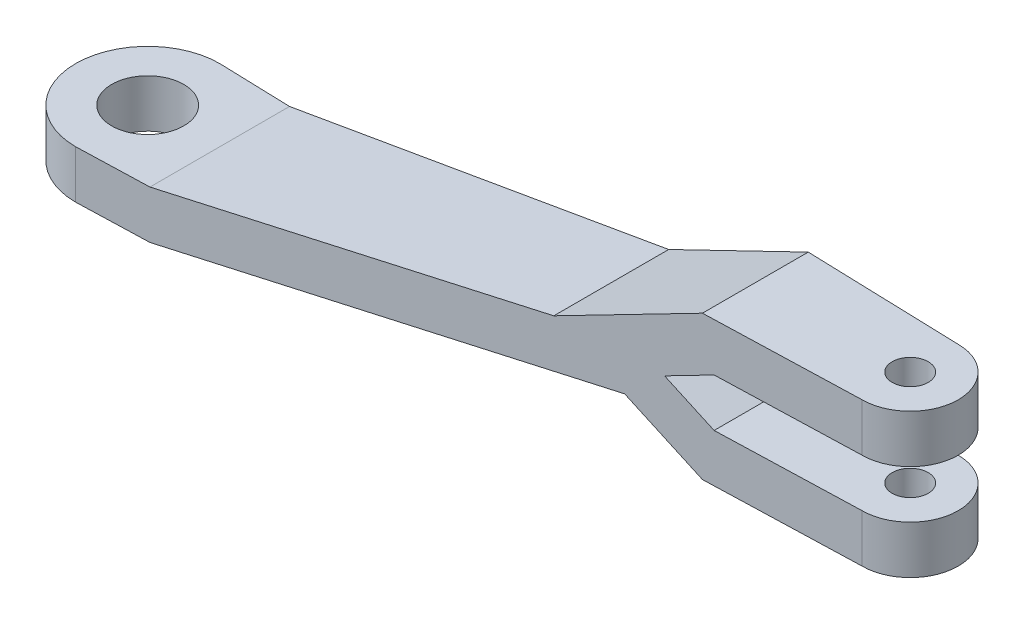
ISO-10303-21;
HEADER;
FILE_DESCRIPTION(('STEP AP214'),'2;1');
FILE_NAME('part.step','',(''),(''),'','','');
FILE_SCHEMA(('AUTOMOTIVE_DESIGN { 1 0 10303 214 1 1 1 1 }'));
ENDSEC;
DATA;
#1=APPLICATION_CONTEXT('core data for automotive mechanical design processes');
#2=APPLICATION_PROTOCOL_DEFINITION('international standard','automotive_design',2000,#1);
#3=PRODUCT_CONTEXT('',#1,'mechanical');
#4=PRODUCT('Part','Part','',(#3));
#5=PRODUCT_RELATED_PRODUCT_CATEGORY('part','',(#4));
#6=PRODUCT_DEFINITION_FORMATION('','',#4);
#7=PRODUCT_DEFINITION_CONTEXT('part definition',#1,'design');
#8=PRODUCT_DEFINITION('design','',#6,#7);
#9=PRODUCT_DEFINITION_SHAPE('','',#8);
#10=(LENGTH_UNIT() NAMED_UNIT(*) SI_UNIT(.MILLI.,.METRE.));
#11=(NAMED_UNIT(*) PLANE_ANGLE_UNIT() SI_UNIT($,.RADIAN.));
#12=(NAMED_UNIT(*) SI_UNIT($,.STERADIAN.) SOLID_ANGLE_UNIT());
#13=UNCERTAINTY_MEASURE_WITH_UNIT(LENGTH_MEASURE(1.E-05),#10,'distance_accuracy_value','');
#14=(GEOMETRIC_REPRESENTATION_CONTEXT(3) GLOBAL_UNCERTAINTY_ASSIGNED_CONTEXT((#13)) GLOBAL_UNIT_ASSIGNED_CONTEXT((#10,
#11,#12)) REPRESENTATION_CONTEXT('',''));
#15=CARTESIAN_POINT('',(0.,0.,0.));
#16=DIRECTION('',(0.,0.,1.));
#17=DIRECTION('',(1.,0.,0.));
#18=AXIS2_PLACEMENT_3D('',#15,#16,#17);
#19=CARTESIAN_POINT('',(-31.75,-6.,0.));
#20=DIRECTION('',(0.,1.,0.));
#21=DIRECTION('',(0.,0.,1.));
#22=AXIS2_PLACEMENT_3D('',#19,#20,#21);
#23=CYLINDRICAL_SURFACE('',#22,3.);
#24=CARTESIAN_POINT('',(-31.75,-0.249999999906133,0.));
#25=DIRECTION('',(0.,-1.,0.));
#26=DIRECTION('',(0.,0.,-1.));
#27=AXIS2_PLACEMENT_3D('',#24,#25,#26);
#28=CIRCLE('',#27,3.);
#29=CARTESIAN_POINT('',(-31.75,-0.249999999906133,-3.));
#30=VERTEX_POINT('',#29);
#31=CARTESIAN_POINT('',(-31.75,-0.249999999906133,3.00000000000001));
#32=VERTEX_POINT('',#31);
#33=EDGE_CURVE('E242',#30,#32,#28,.F.);
#34=ORIENTED_EDGE('',*,*,#33,.F.);
#35=DIRECTION('',(0.,1.,0.));
#36=VECTOR('',#35,1.);
#37=CARTESIAN_POINT('',(-31.75,-6.,-3.));
#38=LINE('',#37,#36);
#39=CARTESIAN_POINT('',(-31.75,-2.24999999967123,-3.));
#40=VERTEX_POINT('',#39);
#41=EDGE_CURVE('E161',#40,#30,#38,.T.);
#42=ORIENTED_EDGE('',*,*,#41,.F.);
#43=CARTESIAN_POINT('',(-31.75,-2.24999999967123,0.));
#44=DIRECTION('',(0.,-1.,0.));
#45=DIRECTION('',(0.,0.,-1.));
#46=AXIS2_PLACEMENT_3D('',#43,#44,#45);
#47=CIRCLE('',#46,3.);
#48=CARTESIAN_POINT('',(-31.75,-2.24999999967123,3.00000000000001));
#49=VERTEX_POINT('',#48);
#50=EDGE_CURVE('E147',#40,#49,#47,.F.);
#51=ORIENTED_EDGE('',*,*,#50,.T.);
#52=DIRECTION('',(0.,1.,0.));
#53=VECTOR('',#52,1.);
#54=CARTESIAN_POINT('',(-31.75,-6.,3.00000000000001));
#55=LINE('',#54,#53);
#56=EDGE_CURVE('E159',#49,#32,#55,.T.);
#57=ORIENTED_EDGE('',*,*,#56,.T.);
#58=EDGE_LOOP('',(#34,#42,#51,#57));
#59=FACE_BOUND('',#58,.T.);
#60=ADVANCED_FACE('F36',(#59),#23,.T.);
#61=CARTESIAN_POINT('',(0.,-6.,0.));
#62=DIRECTION('',(0.,1.,0.));
#63=DIRECTION('',(0.,0.,1.));
#64=AXIS2_PLACEMENT_3D('',#61,#62,#63);
#65=CYLINDRICAL_SURFACE('',#64,2.);
#66=DIRECTION('',(0.,1.,0.));
#67=VECTOR('',#66,1.);
#68=CARTESIAN_POINT('',(0.,-6.,2.));
#69=LINE('',#68,#67);
#70=CARTESIAN_POINT('',(0.,0.,2.));
#71=VERTEX_POINT('',#70);
#72=CARTESIAN_POINT('',(0.,2.,2.));
#73=VERTEX_POINT('',#72);
#74=EDGE_CURVE('E180',#71,#73,#69,.T.);
#75=ORIENTED_EDGE('',*,*,#74,.F.);
#76=CARTESIAN_POINT('',(0.,0.,0.));
#77=DIRECTION('',(0.,-1.,0.));
#78=DIRECTION('',(1.,0.,0.));
#79=AXIS2_PLACEMENT_3D('',#76,#77,#78);
#80=CIRCLE('',#79,2.);
#81=CARTESIAN_POINT('',(0.,0.,-2.));
#82=VERTEX_POINT('',#81);
#83=EDGE_CURVE('E194',#71,#82,#80,.F.);
#84=ORIENTED_EDGE('',*,*,#83,.T.);
#85=DIRECTION('',(0.,1.,0.));
#86=VECTOR('',#85,1.);
#87=CARTESIAN_POINT('',(0.,-6.,-2.));
#88=LINE('',#87,#86);
#89=CARTESIAN_POINT('',(0.,2.,-2.));
#90=VERTEX_POINT('',#89);
#91=EDGE_CURVE('E172',#82,#90,#88,.T.);
#92=ORIENTED_EDGE('',*,*,#91,.T.);
#93=CARTESIAN_POINT('',(0.,2.,0.));
#94=DIRECTION('',(0.,1.,0.));
#95=DIRECTION('',(0.,0.,1.));
#96=AXIS2_PLACEMENT_3D('',#93,#94,#95);
#97=CIRCLE('',#96,2.);
#98=EDGE_CURVE('E189',#90,#73,#97,.F.);
#99=ORIENTED_EDGE('',*,*,#98,.T.);
#100=EDGE_LOOP('',(#75,#84,#92,#99));
#101=FACE_BOUND('',#100,.T.);
#102=ADVANCED_FACE('F271',(#101),#65,.T.);
#103=CARTESIAN_POINT('',(0.,6.,0.));
#104=DIRECTION('',(0.,1.,0.));
#105=DIRECTION('',(0.,0.,1.));
#106=AXIS2_PLACEMENT_3D('',#103,#104,#105);
#107=PLANE('',#106);
#108=CARTESIAN_POINT('',(0.,6.,0.));
#109=DIRECTION('',(0.,1.,0.));
#110=DIRECTION('',(0.,0.,1.));
#111=AXIS2_PLACEMENT_3D('',#108,#109,#110);
#112=CIRCLE('',#111,0.75);
#113=CARTESIAN_POINT('',(0.,6.,0.75));
#114=VERTEX_POINT('',#113);
#115=EDGE_CURVE('E175',#114,#114,#112,.T.);
#116=ORIENTED_EDGE('',*,*,#115,.F.);
#117=EDGE_LOOP('',(#116));
#118=FACE_BOUND('',#117,.T.);
#119=DIRECTION('',(0.999504367728677,0.,0.0314804525268874));
#120=VECTOR('',#119,1.);
#121=CARTESIAN_POINT('',(0.0629296995973984,6.,-1.9980179622174));
#122=LINE('',#121,#120);
#123=CARTESIAN_POINT('',(-6.4481335756774,6.,-2.20309082128118));
#124=VERTEX_POINT('',#123);
#125=CARTESIAN_POINT('',(0.,6.,-2.));
#126=VERTEX_POINT('',#125);
#127=EDGE_CURVE('E259',#124,#126,#122,.T.);
#128=ORIENTED_EDGE('',*,*,#127,.F.);
#129=DIRECTION('',(0.,0.,1.));
#130=VECTOR('',#129,1.);
#131=CARTESIAN_POINT('',(-6.4481335756774,6.,0.));
#132=LINE('',#131,#130);
#133=CARTESIAN_POINT('',(-6.4481335756774,6.,2.20309082128118));
#134=VERTEX_POINT('',#133);
#135=EDGE_CURVE('E168',#124,#134,#132,.T.);
#136=ORIENTED_EDGE('',*,*,#135,.T.);
#137=DIRECTION('',(0.999504367728677,0.,-0.0314804525268876));
#138=VECTOR('',#137,1.);
#139=CARTESIAN_POINT('',(0.0629296995973989,6.,1.99801796221741));
#140=LINE('',#139,#138);
#141=CARTESIAN_POINT('',(0.,6.,2.));
#142=VERTEX_POINT('',#141);
#143=EDGE_CURVE('E255',#134,#142,#140,.T.);
#144=ORIENTED_EDGE('',*,*,#143,.T.);
#145=CARTESIAN_POINT('',(0.,6.,0.));
#146=DIRECTION('',(0.,1.,0.));
#147=DIRECTION('',(0.,0.,1.));
#148=AXIS2_PLACEMENT_3D('',#145,#146,#147);
#149=CIRCLE('',#148,2.);
#150=EDGE_CURVE('E258',#142,#126,#149,.T.);
#151=ORIENTED_EDGE('',*,*,#150,.T.);
#152=EDGE_LOOP('',(#128,#136,#144,#151));
#153=FACE_BOUND('',#152,.T.);
#154=ADVANCED_FACE('F268',(#118,#153),#107,.T.);
#155=CARTESIAN_POINT('',(0.,-6.,0.));
#156=DIRECTION('',(0.,1.,0.));
#157=DIRECTION('',(0.,0.,1.));
#158=AXIS2_PLACEMENT_3D('',#155,#156,#157);
#159=CYLINDRICAL_SURFACE('',#158,0.75);
#160=CARTESIAN_POINT('',(0.,4.,0.));
#161=DIRECTION('',(0.,1.,0.));
#162=DIRECTION('',(-1.,0.,0.));
#163=AXIS2_PLACEMENT_3D('',#160,#161,#162);
#164=CIRCLE('',#163,0.75);
#165=CARTESIAN_POINT('',(-0.75,4.,0.));
#166=VERTEX_POINT('',#165);
#167=EDGE_CURVE('E183',#166,#166,#164,.F.);
#168=ORIENTED_EDGE('',*,*,#167,.T.);
#169=EDGE_LOOP('',(#168));
#170=FACE_BOUND('',#169,.T.);
#171=ORIENTED_EDGE('',*,*,#115,.T.);
#172=EDGE_LOOP('',(#171));
#173=FACE_BOUND('',#172,.T.);
#174=ADVANCED_FACE('F266',(#170,#173),#159,.F.);
#175=CARTESIAN_POINT('',(0.,4.,0.));
#176=DIRECTION('',(0.,1.,0.));
#177=DIRECTION('',(-1.,0.,0.));
#178=AXIS2_PLACEMENT_3D('',#175,#176,#177);
#179=CIRCLE('',#178,2.);
#180=CARTESIAN_POINT('',(0.,4.,-2.));
#181=VERTEX_POINT('',#180);
#182=CARTESIAN_POINT('',(0.,4.,2.));
#183=VERTEX_POINT('',#182);
#184=EDGE_CURVE('E51',#181,#183,#179,.F.);
#185=ORIENTED_EDGE('',*,*,#184,.F.);
#186=EDGE_CURVE('E178',#181,#126,#88,.T.);
#187=ORIENTED_EDGE('',*,*,#186,.T.);
#188=ORIENTED_EDGE('',*,*,#150,.F.);
#189=EDGE_CURVE('E181',#183,#142,#69,.T.);
#190=ORIENTED_EDGE('',*,*,#189,.F.);
#191=EDGE_LOOP('',(#185,#187,#188,#190));
#192=FACE_BOUND('',#191,.T.);
#193=ADVANCED_FACE('F274',(#192),#65,.T.);
#194=CARTESIAN_POINT('',(0.0629296995973984,-6.,-1.9980179622174));
#195=DIRECTION('',(-0.0314804525268874,0.,0.999504367728677));
#196=DIRECTION('',(0.999504367728677,0.,0.0314804525268874));
#197=AXIS2_PLACEMENT_3D('',#194,#195,#196);
#198=PLANE('',#197);
#199=DIRECTION('',(-0.894072492677012,-0.447036246355019,-0.0281597635488822));
#200=VECTOR('',#199,1.);
#201=CARTESIAN_POINT('',(-6.03444407013955,6.20684475277657,-2.19006123055558));
#202=LINE('',#201,#200);
#203=CARTESIAN_POINT('',(-12.4481335754558,2.99999999999999,-2.39206719922695));
#204=VERTEX_POINT('',#203);
#205=EDGE_CURVE('E309',#124,#204,#202,.T.);
#206=ORIENTED_EDGE('',*,*,#205,.F.);
#207=ORIENTED_EDGE('',*,*,#127,.T.);
#208=ORIENTED_EDGE('',*,*,#186,.F.);
#209=DIRECTION('',(-0.999504367728677,0.,-0.0314804525268874));
#210=VECTOR('',#209,1.);
#211=CARTESIAN_POINT('',(0.0629296995973973,4.,-1.9980179622174));
#212=LINE('',#211,#210);
#213=CARTESIAN_POINT('',(-5.97599762072085,4.,-2.18822039750302));
#214=VERTEX_POINT('',#213);
#215=EDGE_CURVE('E276',#181,#214,#212,.T.);
#216=ORIENTED_EDGE('',*,*,#215,.T.);
#217=DIRECTION('',(-0.894072492677012,-0.447036246355019,-0.0281597635488822));
#218=VECTOR('',#217,1.);
#219=CARTESIAN_POINT('',(-5.14072613509668,4.41763574282751,-2.16191263417627));
#220=LINE('',#219,#218);
#221=CARTESIAN_POINT('',(-7.97599762072697,2.99999999996,-2.25121252348746));
#222=VERTEX_POINT('',#221);
#223=EDGE_CURVE('E170',#214,#222,#220,.T.);
#224=ORIENTED_EDGE('',*,*,#223,.T.);
#225=DIRECTION('',(-0.894072492691305,0.447036246326404,-0.0281597635493324));
#226=VECTOR('',#225,1.);
#227=CARTESIAN_POINT('',(2.05356446462519,-2.01478104250015,-1.93532080426377));
#228=LINE('',#227,#226);
#229=CARTESIAN_POINT('',(-5.97599762072084,2.,-2.18822039750302));
#230=VERTEX_POINT('',#229);
#231=EDGE_CURVE('E205',#230,#222,#228,.T.);
#232=ORIENTED_EDGE('',*,*,#231,.F.);
#233=DIRECTION('',(-0.999504367728677,0.,-0.0314804525268874));
#234=VECTOR('',#233,1.);
#235=CARTESIAN_POINT('',(0.0629296995973984,2.,-1.9980179622174));
#236=LINE('',#235,#234);
#237=EDGE_CURVE('E287',#90,#230,#236,.T.);
#238=ORIENTED_EDGE('',*,*,#237,.F.);
#239=ORIENTED_EDGE('',*,*,#91,.F.);
#240=DIRECTION('',(0.999504367728677,0.,0.0314804525268874));
#241=VECTOR('',#240,1.);
#242=CARTESIAN_POINT('',(0.0629296995973978,0.,-1.9980179622174));
#243=LINE('',#242,#241);
#244=CARTESIAN_POINT('',(-6.4481335756774,0.,-2.20309082128118));
#245=VERTEX_POINT('',#244);
#246=EDGE_CURVE('E229',#245,#82,#243,.T.);
#247=ORIENTED_EDGE('',*,*,#246,.F.);
#248=DIRECTION('',(-0.894072492691305,0.447036246326405,-0.0281597635493324));
#249=VECTOR('',#248,1.);
#250=CARTESIAN_POINT('',(1.15984652963279,-3.80399005249131,-1.96346940064149));
#251=LINE('',#250,#249);
#252=CARTESIAN_POINT('',(-9.58839111091583,1.57012876755161,-2.30199657042254));
#253=VERTEX_POINT('',#252);
#254=EDGE_CURVE('E207',#245,#253,#251,.T.);
#255=ORIENTED_EDGE('',*,*,#254,.T.);
#256=DIRECTION('',(0.980233001153636,0.195422853475057,0.0308734803512955));
#257=VECTOR('',#256,1.);
#258=CARTESIAN_POINT('',(-1.75578846478246,3.13166521596971,-2.05530042408764));
#259=LINE('',#258,#257);
#260=CARTESIAN_POINT('',(-28.7500000000529,-2.24999999967123,-2.90551181102529));
#261=VERTEX_POINT('',#260);
#262=EDGE_CURVE('E44',#261,#253,#259,.T.);
#263=ORIENTED_EDGE('',*,*,#262,.F.);
#264=DIRECTION('',(0.999504367728677,0.,0.0314804525268874));
#265=VECTOR('',#264,1.);
#266=CARTESIAN_POINT('',(0.0629296995973984,-2.24999999967123,-1.9980179622174));
#267=LINE('',#266,#265);
#268=EDGE_CURVE('E162',#40,#261,#267,.T.);
#269=ORIENTED_EDGE('',*,*,#268,.F.);
#270=ORIENTED_EDGE('',*,*,#41,.T.);
#271=DIRECTION('',(0.999504367728677,0.,0.0314804525268874));
#272=VECTOR('',#271,1.);
#273=CARTESIAN_POINT('',(0.0629296995973984,-0.249999999906133,-1.9980179622174));
#274=LINE('',#273,#272);
#275=CARTESIAN_POINT('',(-28.7500000000187,-0.249999999906133,-2.90551181102421));
#276=VERTEX_POINT('',#275);
#277=EDGE_CURVE('E202',#30,#276,#274,.T.);
#278=ORIENTED_EDGE('',*,*,#277,.T.);
#279=DIRECTION('',(-0.980233001153636,-0.195422853475056,-0.0308734803512955));
#280=VECTOR('',#279,1.);
#281=CARTESIAN_POINT('',(-2.13890832504786,5.05528503241653,-2.06736719134009));
#282=LINE('',#281,#280);
#283=EDGE_CURVE('E11',#204,#276,#282,.T.);
#284=ORIENTED_EDGE('',*,*,#283,.F.);
#285=EDGE_LOOP('',(#206,#207,#208,#216,#224,#232,#238,#239,#247,#255,#263,#269,#270,#278,#284));
#286=FACE_BOUND('',#285,.T.);
#287=ADVANCED_FACE('F226',(#286),#198,.F.);
#288=CARTESIAN_POINT('',(0.0629296995973989,-6.,1.99801796221741));
#289=DIRECTION('',(0.0314804525268876,0.,0.999504367728677));
#290=DIRECTION('',(0.999504367728677,0.,-0.0314804525268876));
#291=AXIS2_PLACEMENT_3D('',#288,#289,#290);
#292=PLANE('',#291);
#293=ORIENTED_EDGE('',*,*,#143,.F.);
#294=DIRECTION('',(-0.894072492677012,-0.447036246355019,0.0281597635488824));
#295=VECTOR('',#294,1.);
#296=CARTESIAN_POINT('',(-6.03444407013954,6.20684475277657,2.19006123055558));
#297=LINE('',#296,#295);
#298=CARTESIAN_POINT('',(-12.4481335754558,2.99999999999999,2.39206719922696));
#299=VERTEX_POINT('',#298);
#300=EDGE_CURVE('E59',#134,#299,#297,.T.);
#301=ORIENTED_EDGE('',*,*,#300,.T.);
#302=DIRECTION('',(-0.980233001153636,-0.195422853475056,0.0308734803512958));
#303=VECTOR('',#302,1.);
#304=CARTESIAN_POINT('',(-2.13890832504786,5.05528503241653,2.06736719134009));
#305=LINE('',#304,#303);
#306=CARTESIAN_POINT('',(-28.7500000000187,-0.249999999906133,2.90551181102422));
#307=VERTEX_POINT('',#306);
#308=EDGE_CURVE('E253',#299,#307,#305,.T.);
#309=ORIENTED_EDGE('',*,*,#308,.T.);
#310=DIRECTION('',(0.999504367728677,0.,-0.0314804525268876));
#311=VECTOR('',#310,1.);
#312=CARTESIAN_POINT('',(0.0629296995973989,-0.249999999906133,1.99801796221741));
#313=LINE('',#312,#311);
#314=EDGE_CURVE('E167',#32,#307,#313,.T.);
#315=ORIENTED_EDGE('',*,*,#314,.F.);
#316=ORIENTED_EDGE('',*,*,#56,.F.);
#317=DIRECTION('',(0.999504367728677,0.,-0.0314804525268876));
#318=VECTOR('',#317,1.);
#319=CARTESIAN_POINT('',(0.0629296995973989,-2.24999999967123,1.99801796221741));
#320=LINE('',#319,#318);
#321=CARTESIAN_POINT('',(-28.7500000000529,-2.24999999967123,2.90551181102529));
#322=VERTEX_POINT('',#321);
#323=EDGE_CURVE('E144',#49,#322,#320,.T.);
#324=ORIENTED_EDGE('',*,*,#323,.T.);
#325=DIRECTION('',(0.980233001153636,0.195422853475057,-0.0308734803512958));
#326=VECTOR('',#325,1.);
#327=CARTESIAN_POINT('',(-1.75578846478246,3.13166521596971,2.05530042408764));
#328=LINE('',#327,#326);
#329=CARTESIAN_POINT('',(-9.58839111091583,1.57012876755161,2.30199657042255));
#330=VERTEX_POINT('',#329);
#331=EDGE_CURVE('E251',#322,#330,#328,.T.);
#332=ORIENTED_EDGE('',*,*,#331,.T.);
#333=DIRECTION('',(-0.894072492691305,0.447036246326405,0.0281597635493326));
#334=VECTOR('',#333,1.);
#335=CARTESIAN_POINT('',(1.15984652963279,-3.80399005249131,1.96346940064149));
#336=LINE('',#335,#334);
#337=CARTESIAN_POINT('',(-6.4481335756774,0.,2.20309082128118));
#338=VERTEX_POINT('',#337);
#339=EDGE_CURVE('E221',#338,#330,#336,.T.);
#340=ORIENTED_EDGE('',*,*,#339,.F.);
#341=DIRECTION('',(0.999504367728677,0.,-0.0314804525268876));
#342=VECTOR('',#341,1.);
#343=CARTESIAN_POINT('',(0.0629296995973983,0.,1.99801796221741));
#344=LINE('',#343,#342);
#345=EDGE_CURVE('E199',#338,#71,#344,.T.);
#346=ORIENTED_EDGE('',*,*,#345,.T.);
#347=ORIENTED_EDGE('',*,*,#74,.T.);
#348=DIRECTION('',(-0.999504367728677,0.,0.0314804525268876));
#349=VECTOR('',#348,1.);
#350=CARTESIAN_POINT('',(0.0629296995973989,2.,1.99801796221741));
#351=LINE('',#350,#349);
#352=CARTESIAN_POINT('',(-5.97599762072084,2.,2.18822039750302));
#353=VERTEX_POINT('',#352);
#354=EDGE_CURVE('E195',#73,#353,#351,.T.);
#355=ORIENTED_EDGE('',*,*,#354,.T.);
#356=DIRECTION('',(-0.894072492691305,0.447036246326404,0.0281597635493326));
#357=VECTOR('',#356,1.);
#358=CARTESIAN_POINT('',(2.05356446462519,-2.01478104250015,1.93532080426377));
#359=LINE('',#358,#357);
#360=CARTESIAN_POINT('',(-7.97599762072697,2.99999999996,2.25121252348747));
#361=VERTEX_POINT('',#360);
#362=EDGE_CURVE('E247',#353,#361,#359,.T.);
#363=ORIENTED_EDGE('',*,*,#362,.T.);
#364=DIRECTION('',(-0.894072492677012,-0.447036246355019,0.0281597635488824));
#365=VECTOR('',#364,1.);
#366=CARTESIAN_POINT('',(-5.14072613509668,4.41763574282751,2.16191263417627));
#367=LINE('',#366,#365);
#368=CARTESIAN_POINT('',(-5.97599762072085,4.,2.18822039750302));
#369=VERTEX_POINT('',#368);
#370=EDGE_CURVE('E245',#369,#361,#367,.T.);
#371=ORIENTED_EDGE('',*,*,#370,.F.);
#372=DIRECTION('',(-0.999504367728677,0.,0.0314804525268876));
#373=VECTOR('',#372,1.);
#374=CARTESIAN_POINT('',(0.0629296995973978,4.,1.99801796221741));
#375=LINE('',#374,#373);
#376=EDGE_CURVE('E190',#183,#369,#375,.T.);
#377=ORIENTED_EDGE('',*,*,#376,.F.);
#378=ORIENTED_EDGE('',*,*,#189,.T.);
#379=EDGE_LOOP('',(#293,#301,#309,#315,#316,#324,#332,#340,#346,#347,#355,#363,#371,#377,#378));
#380=FACE_BOUND('',#379,.T.);
#381=ADVANCED_FACE('F38',(#380),#292,.T.);
#382=CARTESIAN_POINT('',(0.,-0.249999999906133,-3.));
#383=DIRECTION('',(0.,-1.,0.));
#384=DIRECTION('',(0.,0.,-1.));
#385=AXIS2_PLACEMENT_3D('',#382,#383,#384);
#386=PLANE('',#385);
#387=ORIENTED_EDGE('',*,*,#314,.T.);
#388=DIRECTION('',(0.,0.,1.));
#389=VECTOR('',#388,1.);
#390=CARTESIAN_POINT('',(-28.7500000000187,-0.249999999906133,-3.));
#391=LINE('',#390,#389);
#392=EDGE_CURVE('E485',#276,#307,#391,.T.);
#393=ORIENTED_EDGE('',*,*,#392,.F.);
#394=ORIENTED_EDGE('',*,*,#277,.F.);
#395=ORIENTED_EDGE('',*,*,#33,.T.);
#396=EDGE_LOOP('',(#387,#393,#394,#395));
#397=FACE_BOUND('',#396,.T.);
#398=CARTESIAN_POINT('',(-31.75,-0.249999999906133,0.));
#399=DIRECTION('',(0.,-1.,0.));
#400=DIRECTION('',(0.,0.,-1.));
#401=AXIS2_PLACEMENT_3D('',#398,#399,#400);
#402=CIRCLE('',#401,1.5);
#403=CARTESIAN_POINT('',(-31.75,-0.249999999906133,-1.5));
#404=VERTEX_POINT('',#403);
#405=EDGE_CURVE('E154',#404,#404,#402,.F.);
#406=ORIENTED_EDGE('',*,*,#405,.F.);
#407=EDGE_LOOP('',(#406));
#408=FACE_BOUND('',#407,.T.);
#409=ADVANCED_FACE('F438',(#397,#408),#386,.F.);
#410=CARTESIAN_POINT('',(-3.68962671526489,7.3792534302572,-3.));
#411=DIRECTION('',(-0.447213595513173,0.894427190993308,0.));
#412=DIRECTION('',(-0.894427190993308,-0.447213595513173,0.));
#413=AXIS2_PLACEMENT_3D('',#410,#411,#412);
#414=PLANE('',#413);
#415=ORIENTED_EDGE('',*,*,#135,.F.);
#416=ORIENTED_EDGE('',*,*,#205,.T.);
#417=DIRECTION('',(0.,0.,1.));
#418=VECTOR('',#417,1.);
#419=CARTESIAN_POINT('',(-12.4481335754558,2.99999999999999,-3.));
#420=LINE('',#419,#418);
#421=EDGE_CURVE('E310',#204,#299,#420,.T.);
#422=ORIENTED_EDGE('',*,*,#421,.T.);
#423=ORIENTED_EDGE('',*,*,#300,.F.);
#424=EDGE_LOOP('',(#415,#416,#422,#423));
#425=FACE_BOUND('',#424,.T.);
#426=ADVANCED_FACE('F445',(#425),#414,.T.);
#427=CARTESIAN_POINT('',(-1.051077009668,5.2721590812405,-3.));
#428=DIRECTION('',(-0.195516055884211,0.980700500607337,0.));
#429=DIRECTION('',(-0.980700500607338,-0.195516055884211,0.));
#430=AXIS2_PLACEMENT_3D('',#427,#428,#429);
#431=PLANE('',#430);
#432=ORIENTED_EDGE('',*,*,#421,.F.);
#433=ORIENTED_EDGE('',*,*,#283,.T.);
#434=ORIENTED_EDGE('',*,*,#392,.T.);
#435=ORIENTED_EDGE('',*,*,#308,.F.);
#436=EDGE_LOOP('',(#432,#433,#434,#435));
#437=FACE_BOUND('',#436,.T.);
#438=ADVANCED_FACE('F349',(#437),#431,.T.);
#439=CARTESIAN_POINT('',(0.,4.,-3.));
#440=DIRECTION('',(0.,1.,0.));
#441=DIRECTION('',(-1.,0.,0.));
#442=AXIS2_PLACEMENT_3D('',#439,#440,#441);
#443=PLANE('',#442);
#444=ORIENTED_EDGE('',*,*,#376,.T.);
#445=DIRECTION('',(0.,0.,1.));
#446=VECTOR('',#445,1.);
#447=CARTESIAN_POINT('',(-5.97599762072085,4.,-3.));
#448=LINE('',#447,#446);
#449=EDGE_CURVE('E306',#214,#369,#448,.T.);
#450=ORIENTED_EDGE('',*,*,#449,.F.);
#451=ORIENTED_EDGE('',*,*,#215,.F.);
#452=ORIENTED_EDGE('',*,*,#184,.T.);
#453=EDGE_LOOP('',(#444,#450,#451,#452));
#454=FACE_BOUND('',#453,.T.);
#455=ORIENTED_EDGE('',*,*,#167,.F.);
#456=EDGE_LOOP('',(#455));
#457=FACE_BOUND('',#456,.T.);
#458=ADVANCED_FACE('F312',(#454,#457),#443,.F.);
#459=CARTESIAN_POINT('',(-2.79519952425027,5.59039904829404,-3.));
#460=DIRECTION('',(-0.447213595513174,0.894427190993308,0.));
#461=DIRECTION('',(-0.894427190993308,-0.447213595513174,0.));
#462=AXIS2_PLACEMENT_3D('',#459,#460,#461);
#463=PLANE('',#462);
#464=ORIENTED_EDGE('',*,*,#370,.T.);
#465=DIRECTION('',(0.,0.,1.));
#466=VECTOR('',#465,1.);
#467=CARTESIAN_POINT('',(-7.97599762072697,2.99999999996,-3.));
#468=LINE('',#467,#466);
#469=EDGE_CURVE('E300',#222,#361,#468,.T.);
#470=ORIENTED_EDGE('',*,*,#469,.F.);
#471=ORIENTED_EDGE('',*,*,#223,.F.);
#472=ORIENTED_EDGE('',*,*,#449,.T.);
#473=EDGE_LOOP('',(#464,#470,#471,#472));
#474=FACE_BOUND('',#473,.T.);
#475=ADVANCED_FACE('F315',(#474),#463,.F.);
#476=CARTESIAN_POINT('',(0.,2.,-3.));
#477=DIRECTION('',(0.,1.,0.));
#478=DIRECTION('',(0.,0.,1.));
#479=AXIS2_PLACEMENT_3D('',#476,#477,#478);
#480=PLANE('',#479);
#481=CARTESIAN_POINT('',(0.,2.,0.));
#482=DIRECTION('',(0.,1.,0.));
#483=DIRECTION('',(0.,0.,1.));
#484=AXIS2_PLACEMENT_3D('',#481,#482,#483);
#485=CIRCLE('',#484,0.75);
#486=CARTESIAN_POINT('',(0.,2.,0.75));
#487=VERTEX_POINT('',#486);
#488=EDGE_CURVE('E186',#487,#487,#485,.F.);
#489=ORIENTED_EDGE('',*,*,#488,.T.);
#490=EDGE_LOOP('',(#489));
#491=FACE_BOUND('',#490,.T.);
#492=ORIENTED_EDGE('',*,*,#98,.F.);
#493=ORIENTED_EDGE('',*,*,#237,.T.);
#494=DIRECTION('',(0.,0.,1.));
#495=VECTOR('',#494,1.);
#496=CARTESIAN_POINT('',(-5.97599762072085,2.,-3.));
#497=LINE('',#496,#495);
#498=EDGE_CURVE('E296',#230,#353,#497,.T.);
#499=ORIENTED_EDGE('',*,*,#498,.T.);
#500=ORIENTED_EDGE('',*,*,#354,.F.);
#501=EDGE_LOOP('',(#492,#493,#499,#500));
#502=FACE_BOUND('',#501,.T.);
#503=ADVANCED_FACE('F294',(#491,#502),#480,.T.);
#504=CARTESIAN_POINT('',(-0.395199524082496,-0.790399048199026,-3.));
#505=DIRECTION('',(0.447213595484553,0.894427191007618,0.));
#506=DIRECTION('',(-0.894427191007618,0.447213595484553,0.));
#507=AXIS2_PLACEMENT_3D('',#504,#505,#506);
#508=PLANE('',#507);
#509=ORIENTED_EDGE('',*,*,#498,.F.);
#510=ORIENTED_EDGE('',*,*,#231,.T.);
#511=ORIENTED_EDGE('',*,*,#469,.T.);
#512=ORIENTED_EDGE('',*,*,#362,.F.);
#513=EDGE_LOOP('',(#509,#510,#511,#512));
#514=FACE_BOUND('',#513,.T.);
#515=ADVANCED_FACE('F318',(#514),#508,.T.);
#516=ORIENTED_EDGE('',*,*,#488,.F.);
#517=EDGE_LOOP('',(#516));
#518=FACE_BOUND('',#517,.T.);
#519=CARTESIAN_POINT('',(0.,0.,0.));
#520=DIRECTION('',(0.,-1.,0.));
#521=DIRECTION('',(1.,0.,0.));
#522=AXIS2_PLACEMENT_3D('',#519,#520,#521);
#523=CIRCLE('',#522,0.75);
#524=CARTESIAN_POINT('',(0.75,0.,0.));
#525=VERTEX_POINT('',#524);
#526=EDGE_CURVE('E191',#525,#525,#523,.F.);
#527=ORIENTED_EDGE('',*,*,#526,.F.);
#528=EDGE_LOOP('',(#527));
#529=FACE_BOUND('',#528,.T.);
#530=ADVANCED_FACE('F320',(#518,#529),#159,.F.);
#531=CARTESIAN_POINT('',(-0.667591621949515,3.34861213769004,-3.));
#532=DIRECTION('',(0.195516055884211,-0.980700500607337,0.));
#533=DIRECTION('',(0.980700500607337,0.195516055884211,0.));
#534=AXIS2_PLACEMENT_3D('',#531,#532,#533);
#535=PLANE('',#534);
#536=DIRECTION('',(0.,0.,1.));
#537=VECTOR('',#536,1.);
#538=CARTESIAN_POINT('',(-28.7500000000529,-2.24999999967123,-3.));
#539=LINE('',#538,#537);
#540=EDGE_CURVE('E150',#261,#322,#539,.T.);
#541=ORIENTED_EDGE('',*,*,#540,.F.);
#542=ORIENTED_EDGE('',*,*,#262,.T.);
#543=DIRECTION('',(0.,0.,1.));
#544=VECTOR('',#543,1.);
#545=CARTESIAN_POINT('',(-9.58839111091583,1.57012876755161,-3.));
#546=LINE('',#545,#544);
#547=EDGE_CURVE('E214',#253,#330,#546,.T.);
#548=ORIENTED_EDGE('',*,*,#547,.T.);
#549=ORIENTED_EDGE('',*,*,#331,.F.);
#550=EDGE_LOOP('',(#541,#542,#548,#549));
#551=FACE_BOUND('',#550,.T.);
#552=ADVANCED_FACE('F213',(#551),#535,.T.);
#553=CARTESIAN_POINT('',(-1.28962671504664,-2.57925343020433,-3.));
#554=DIRECTION('',(0.447213595484553,0.894427191007618,0.));
#555=DIRECTION('',(-0.894427191007618,0.447213595484553,0.));
#556=AXIS2_PLACEMENT_3D('',#553,#554,#555);
#557=PLANE('',#556);
#558=ORIENTED_EDGE('',*,*,#339,.T.);
#559=ORIENTED_EDGE('',*,*,#547,.F.);
#560=ORIENTED_EDGE('',*,*,#254,.F.);
#561=DIRECTION('',(0.,0.,1.));
#562=VECTOR('',#561,1.);
#563=CARTESIAN_POINT('',(-6.4481335756774,0.,-3.));
#564=LINE('',#563,#562);
#565=EDGE_CURVE('E222',#245,#338,#564,.T.);
#566=ORIENTED_EDGE('',*,*,#565,.T.);
#567=EDGE_LOOP('',(#558,#559,#560,#566));
#568=FACE_BOUND('',#567,.T.);
#569=ADVANCED_FACE('F217',(#568),#557,.F.);
#570=CARTESIAN_POINT('',(0.,-2.24999999967123,-3.));
#571=DIRECTION('',(0.,-1.,0.));
#572=DIRECTION('',(0.,0.,-1.));
#573=AXIS2_PLACEMENT_3D('',#570,#571,#572);
#574=PLANE('',#573);
#575=CARTESIAN_POINT('',(-31.75,-2.24999999967123,0.));
#576=DIRECTION('',(0.,-1.,0.));
#577=DIRECTION('',(0.,0.,-1.));
#578=AXIS2_PLACEMENT_3D('',#575,#576,#577);
#579=CIRCLE('',#578,1.5);
#580=CARTESIAN_POINT('',(-31.75,-2.24999999967123,-1.5));
#581=VERTEX_POINT('',#580);
#582=EDGE_CURVE('E196',#581,#581,#579,.F.);
#583=ORIENTED_EDGE('',*,*,#582,.T.);
#584=EDGE_LOOP('',(#583));
#585=FACE_BOUND('',#584,.T.);
#586=ORIENTED_EDGE('',*,*,#50,.F.);
#587=ORIENTED_EDGE('',*,*,#268,.T.);
#588=ORIENTED_EDGE('',*,*,#540,.T.);
#589=ORIENTED_EDGE('',*,*,#323,.F.);
#590=EDGE_LOOP('',(#586,#587,#588,#589));
#591=FACE_BOUND('',#590,.T.);
#592=ADVANCED_FACE('F146',(#585,#591),#574,.T.);
#593=CARTESIAN_POINT('',(0.,0.,-3.));
#594=DIRECTION('',(0.,-1.,0.));
#595=DIRECTION('',(1.,0.,0.));
#596=AXIS2_PLACEMENT_3D('',#593,#594,#595);
#597=PLANE('',#596);
#598=ORIENTED_EDGE('',*,*,#526,.T.);
#599=EDGE_LOOP('',(#598));
#600=FACE_BOUND('',#599,.T.);
#601=ORIENTED_EDGE('',*,*,#565,.F.);
#602=ORIENTED_EDGE('',*,*,#246,.T.);
#603=ORIENTED_EDGE('',*,*,#83,.F.);
#604=ORIENTED_EDGE('',*,*,#345,.F.);
#605=EDGE_LOOP('',(#601,#602,#603,#604));
#606=FACE_BOUND('',#605,.T.);
#607=ADVANCED_FACE('F298',(#600,#606),#597,.T.);
#608=CARTESIAN_POINT('',(-31.75,-6.,0.));
#609=DIRECTION('',(0.,1.,0.));
#610=DIRECTION('',(0.,0.,1.));
#611=AXIS2_PLACEMENT_3D('',#608,#609,#610);
#612=CYLINDRICAL_SURFACE('',#611,1.5);
#613=ORIENTED_EDGE('',*,*,#405,.T.);
#614=EDGE_LOOP('',(#613));
#615=FACE_BOUND('',#614,.T.);
#616=ORIENTED_EDGE('',*,*,#582,.F.);
#617=EDGE_LOOP('',(#616));
#618=FACE_BOUND('',#617,.T.);
#619=ADVANCED_FACE('F338',(#615,#618),#612,.F.);
#620=CLOSED_SHELL('',(#60,#102,#154,#174,#193,#287,#381,#409,#426,#438,#458,#475,#503,#515,#530,
#552,#569,#592,#607,#619));
#621=MANIFOLD_SOLID_BREP('B2',#620);
#622=ADVANCED_BREP_SHAPE_REPRESENTATION('',(#18,#621),#14);
#623=SHAPE_DEFINITION_REPRESENTATION(#9,#622);
ENDSEC;
END-ISO-10303-21;
